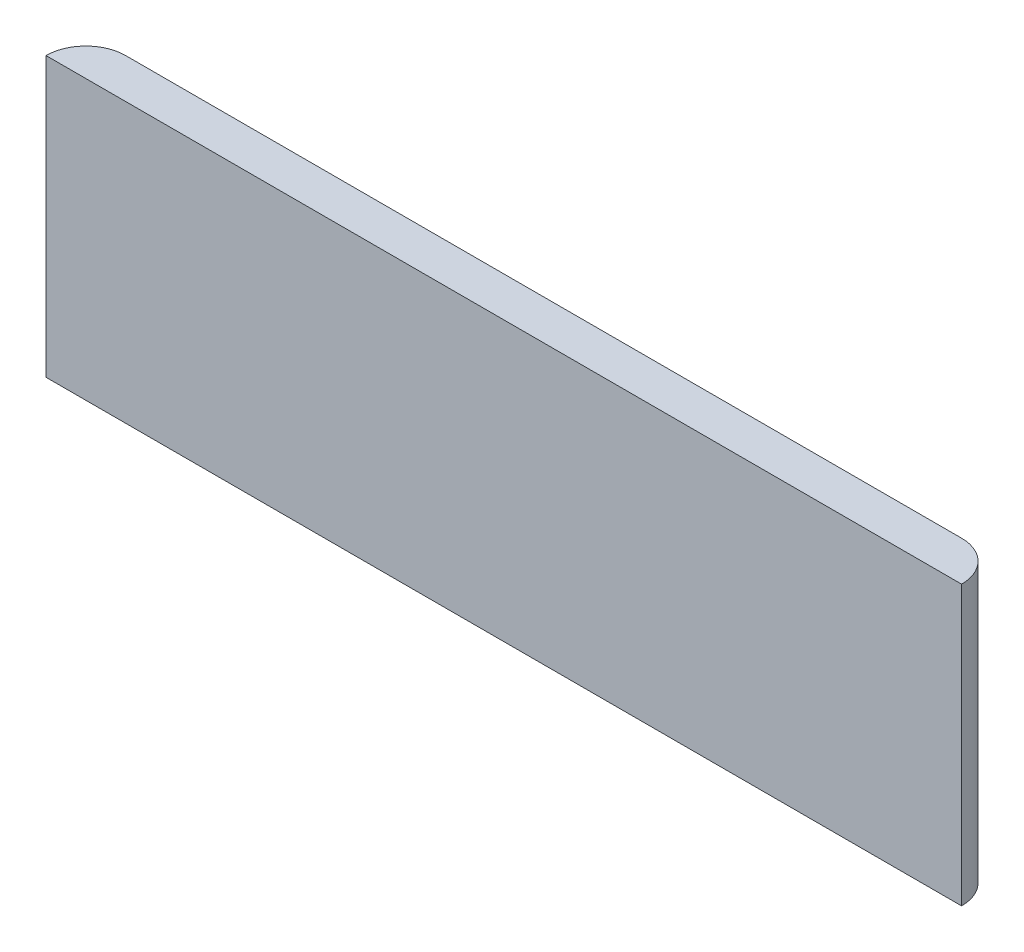
ISO-10303-21;
HEADER;
FILE_DESCRIPTION(('STEP AP214'),'2;1');
FILE_NAME('part.step','',(''),(''),'','','');
FILE_SCHEMA(('AUTOMOTIVE_DESIGN { 1 0 10303 214 1 1 1 1 }'));
ENDSEC;
DATA;
#1=APPLICATION_CONTEXT('core data for automotive mechanical design processes');
#2=APPLICATION_PROTOCOL_DEFINITION('international standard','automotive_design',2000,#1);
#3=PRODUCT_CONTEXT('',#1,'mechanical');
#4=PRODUCT('Part','Part','',(#3));
#5=PRODUCT_RELATED_PRODUCT_CATEGORY('part','',(#4));
#6=PRODUCT_DEFINITION_FORMATION('','',#4);
#7=PRODUCT_DEFINITION_CONTEXT('part definition',#1,'design');
#8=PRODUCT_DEFINITION('design','',#6,#7);
#9=PRODUCT_DEFINITION_SHAPE('','',#8);
#10=(LENGTH_UNIT() NAMED_UNIT(*) SI_UNIT(.MILLI.,.METRE.));
#11=(NAMED_UNIT(*) PLANE_ANGLE_UNIT() SI_UNIT($,.RADIAN.));
#12=(NAMED_UNIT(*) SI_UNIT($,.STERADIAN.) SOLID_ANGLE_UNIT());
#13=UNCERTAINTY_MEASURE_WITH_UNIT(LENGTH_MEASURE(1.E-05),#10,'distance_accuracy_value','');
#14=(GEOMETRIC_REPRESENTATION_CONTEXT(3) GLOBAL_UNCERTAINTY_ASSIGNED_CONTEXT((#13)) GLOBAL_UNIT_ASSIGNED_CONTEXT((#10,
#11,#12)) REPRESENTATION_CONTEXT('',''));
#15=CARTESIAN_POINT('',(0.,0.,0.));
#16=DIRECTION('',(0.,0.,1.));
#17=DIRECTION('',(1.,0.,0.));
#18=AXIS2_PLACEMENT_3D('',#15,#16,#17);
#19=CARTESIAN_POINT('',(0.,44.45,0.));
#20=DIRECTION('',(0.,0.,1.));
#21=DIRECTION('',(1.,0.,0.));
#22=AXIS2_PLACEMENT_3D('',#19,#20,#21);
#23=PLANE('',#22);
#24=DIRECTION('',(-1.,0.,0.));
#25=VECTOR('',#24,1.);
#26=CARTESIAN_POINT('',(0.,44.45,0.));
#27=LINE('',#26,#25);
#28=CARTESIAN_POINT('',(-6.35,44.45,0.));
#29=VERTEX_POINT('',#28);
#30=CARTESIAN_POINT('',(-139.7,44.45,0.));
#31=VERTEX_POINT('',#30);
#32=EDGE_CURVE('E77',#29,#31,#27,.T.);
#33=ORIENTED_EDGE('',*,*,#32,.F.);
#34=DIRECTION('',(0.,-1.,0.));
#35=VECTOR('',#34,1.);
#36=CARTESIAN_POINT('',(-6.35,44.45,0.));
#37=LINE('',#36,#35);
#38=CARTESIAN_POINT('',(-6.35,0.,0.));
#39=VERTEX_POINT('',#38);
#40=EDGE_CURVE('E92',#29,#39,#37,.T.);
#41=ORIENTED_EDGE('',*,*,#40,.T.);
#42=DIRECTION('',(-1.,0.,0.));
#43=VECTOR('',#42,1.);
#44=CARTESIAN_POINT('',(0.,0.,0.));
#45=LINE('',#44,#43);
#46=CARTESIAN_POINT('',(-139.7,0.,0.));
#47=VERTEX_POINT('',#46);
#48=EDGE_CURVE('E104',#39,#47,#45,.T.);
#49=ORIENTED_EDGE('',*,*,#48,.T.);
#50=DIRECTION('',(0.,-1.,0.));
#51=VECTOR('',#50,1.);
#52=CARTESIAN_POINT('',(-139.7,44.45,0.));
#53=LINE('',#52,#51);
#54=EDGE_CURVE('E50',#47,#31,#53,.F.);
#55=ORIENTED_EDGE('',*,*,#54,.T.);
#56=EDGE_LOOP('',(#33,#41,#49,#55));
#57=FACE_BOUND('',#56,.T.);
#58=ADVANCED_FACE('F35',(#57),#23,.F.);
#59=CARTESIAN_POINT('',(0.,44.45,6.35));
#60=DIRECTION('',(0.,0.,-1.));
#61=DIRECTION('',(-1.,0.,0.));
#62=AXIS2_PLACEMENT_3D('',#59,#60,#61);
#63=PLANE('',#62);
#64=DIRECTION('',(1.,0.,0.));
#65=VECTOR('',#64,1.);
#66=CARTESIAN_POINT('',(0.,0.,6.35));
#67=LINE('',#66,#65);
#68=CARTESIAN_POINT('',(-146.05,0.,6.35000000000002));
#69=VERTEX_POINT('',#68);
#70=CARTESIAN_POINT('',(0.,0.,6.35));
#71=VERTEX_POINT('',#70);
#72=EDGE_CURVE('E103',#69,#71,#67,.T.);
#73=ORIENTED_EDGE('',*,*,#72,.T.);
#74=DIRECTION('',(0.,-1.,0.));
#75=VECTOR('',#74,1.);
#76=CARTESIAN_POINT('',(0.,44.45,6.35));
#77=LINE('',#76,#75);
#78=CARTESIAN_POINT('',(0.,44.45,6.35));
#79=VERTEX_POINT('',#78);
#80=EDGE_CURVE('E88',#79,#71,#77,.T.);
#81=ORIENTED_EDGE('',*,*,#80,.F.);
#82=DIRECTION('',(1.,0.,0.));
#83=VECTOR('',#82,1.);
#84=CARTESIAN_POINT('',(0.,44.45,6.35));
#85=LINE('',#84,#83);
#86=CARTESIAN_POINT('',(-146.05,44.45,6.35000000000002));
#87=VERTEX_POINT('',#86);
#88=EDGE_CURVE('E75',#87,#79,#85,.T.);
#89=ORIENTED_EDGE('',*,*,#88,.F.);
#90=DIRECTION('',(0.,-1.,0.));
#91=VECTOR('',#90,1.);
#92=CARTESIAN_POINT('',(-146.05,44.45,6.35000000000002));
#93=LINE('',#92,#91);
#94=EDGE_CURVE('E85',#87,#69,#93,.T.);
#95=ORIENTED_EDGE('',*,*,#94,.T.);
#96=EDGE_LOOP('',(#73,#81,#89,#95));
#97=FACE_BOUND('',#96,.T.);
#98=ADVANCED_FACE('F84',(#97),#63,.F.);
#99=CARTESIAN_POINT('',(0.,44.45,0.));
#100=DIRECTION('',(0.,-1.,0.));
#101=DIRECTION('',(0.,0.,-1.));
#102=AXIS2_PLACEMENT_3D('',#99,#100,#101);
#103=PLANE('',#102);
#104=ORIENTED_EDGE('',*,*,#88,.T.);
#105=CARTESIAN_POINT('',(-6.35,44.45,6.35));
#106=DIRECTION('',(0.,-1.,0.));
#107=DIRECTION('',(0.,0.,-1.));
#108=AXIS2_PLACEMENT_3D('',#105,#106,#107);
#109=CIRCLE('',#108,6.35);
#110=EDGE_CURVE('E11',#79,#29,#109,.F.);
#111=ORIENTED_EDGE('',*,*,#110,.T.);
#112=ORIENTED_EDGE('',*,*,#32,.T.);
#113=CARTESIAN_POINT('',(-139.7,44.45,6.35));
#114=DIRECTION('',(0.,-1.,0.));
#115=DIRECTION('',(0.,0.,-1.));
#116=AXIS2_PLACEMENT_3D('',#113,#114,#115);
#117=CIRCLE('',#116,6.35);
#118=EDGE_CURVE('E43',#31,#87,#117,.F.);
#119=ORIENTED_EDGE('',*,*,#118,.T.);
#120=EDGE_LOOP('',(#104,#111,#112,#119));
#121=FACE_BOUND('',#120,.T.);
#122=ADVANCED_FACE('F74',(#121),#103,.F.);
#123=CARTESIAN_POINT('',(0.,0.,0.));
#124=DIRECTION('',(0.,-1.,0.));
#125=DIRECTION('',(0.,0.,-1.));
#126=AXIS2_PLACEMENT_3D('',#123,#124,#125);
#127=PLANE('',#126);
#128=ORIENTED_EDGE('',*,*,#48,.F.);
#129=CARTESIAN_POINT('',(-6.35,0.,6.35));
#130=DIRECTION('',(0.,-1.,0.));
#131=DIRECTION('',(0.,0.,-1.));
#132=AXIS2_PLACEMENT_3D('',#129,#130,#131);
#133=CIRCLE('',#132,6.35);
#134=EDGE_CURVE('E80',#39,#71,#133,.T.);
#135=ORIENTED_EDGE('',*,*,#134,.T.);
#136=ORIENTED_EDGE('',*,*,#72,.F.);
#137=CARTESIAN_POINT('',(-139.7,0.,6.35));
#138=DIRECTION('',(0.,-1.,0.));
#139=DIRECTION('',(0.,0.,-1.));
#140=AXIS2_PLACEMENT_3D('',#137,#138,#139);
#141=CIRCLE('',#140,6.35);
#142=EDGE_CURVE('E90',#69,#47,#141,.T.);
#143=ORIENTED_EDGE('',*,*,#142,.T.);
#144=EDGE_LOOP('',(#128,#135,#136,#143));
#145=FACE_BOUND('',#144,.T.);
#146=ADVANCED_FACE('F102',(#145),#127,.T.);
#147=CARTESIAN_POINT('',(-6.35,44.45,6.35));
#148=DIRECTION('',(0.,-1.,0.));
#149=DIRECTION('',(0.,0.,-1.));
#150=AXIS2_PLACEMENT_3D('',#147,#148,#149);
#151=CYLINDRICAL_SURFACE('',#150,6.35);
#152=ORIENTED_EDGE('',*,*,#110,.F.);
#153=ORIENTED_EDGE('',*,*,#80,.T.);
#154=ORIENTED_EDGE('',*,*,#134,.F.);
#155=ORIENTED_EDGE('',*,*,#40,.F.);
#156=EDGE_LOOP('',(#152,#153,#154,#155));
#157=FACE_BOUND('',#156,.T.);
#158=ADVANCED_FACE('F107',(#157),#151,.T.);
#159=CARTESIAN_POINT('',(-139.7,44.45,6.35));
#160=DIRECTION('',(0.,-1.,0.));
#161=DIRECTION('',(0.,0.,-1.));
#162=AXIS2_PLACEMENT_3D('',#159,#160,#161);
#163=CYLINDRICAL_SURFACE('',#162,6.35);
#164=ORIENTED_EDGE('',*,*,#118,.F.);
#165=ORIENTED_EDGE('',*,*,#54,.F.);
#166=ORIENTED_EDGE('',*,*,#142,.F.);
#167=ORIENTED_EDGE('',*,*,#94,.F.);
#168=EDGE_LOOP('',(#164,#165,#166,#167));
#169=FACE_BOUND('',#168,.T.);
#170=ADVANCED_FACE('F37',(#169),#163,.T.);
#171=CLOSED_SHELL('',(#58,#98,#122,#146,#158,#170));
#172=MANIFOLD_SOLID_BREP('B2',#171);
#173=ADVANCED_BREP_SHAPE_REPRESENTATION('',(#18,#172),#14);
#174=SHAPE_DEFINITION_REPRESENTATION(#9,#173);
ENDSEC;
END-ISO-10303-21;
